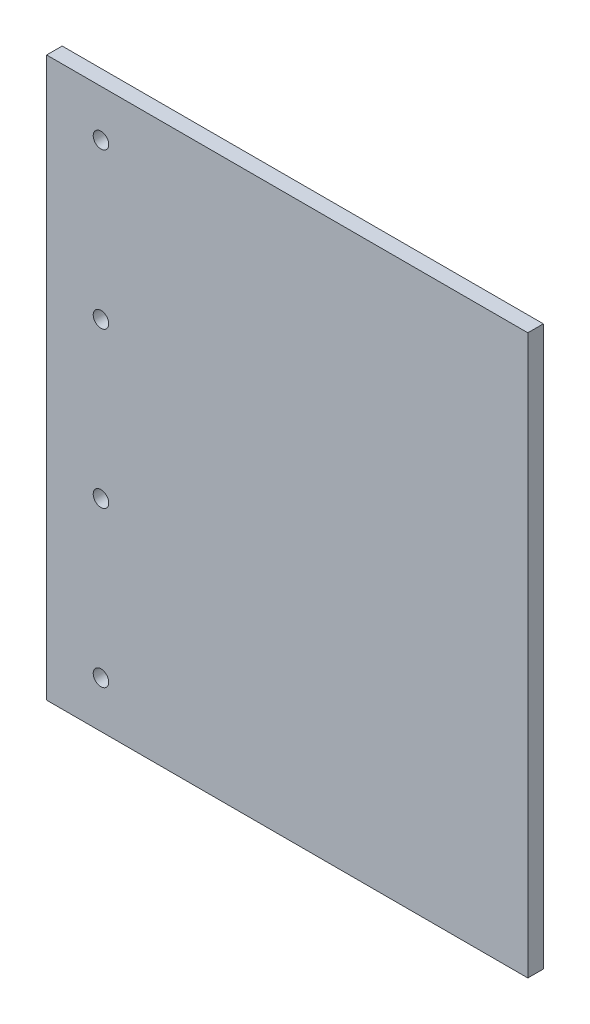
ISO-10303-21;
HEADER;
FILE_DESCRIPTION(('STEP AP214'),'2;1');
FILE_NAME('part.step','',(''),(''),'','','');
FILE_SCHEMA(('AUTOMOTIVE_DESIGN { 1 0 10303 214 1 1 1 1 }'));
ENDSEC;
DATA;
#1=APPLICATION_CONTEXT('core data for automotive mechanical design processes');
#2=APPLICATION_PROTOCOL_DEFINITION('international standard','automotive_design',2000,#1);
#3=PRODUCT_CONTEXT('',#1,'mechanical');
#4=PRODUCT('Part','Part','',(#3));
#5=PRODUCT_RELATED_PRODUCT_CATEGORY('part','',(#4));
#6=PRODUCT_DEFINITION_FORMATION('','',#4);
#7=PRODUCT_DEFINITION_CONTEXT('part definition',#1,'design');
#8=PRODUCT_DEFINITION('design','',#6,#7);
#9=PRODUCT_DEFINITION_SHAPE('','',#8);
#10=(LENGTH_UNIT() NAMED_UNIT(*) SI_UNIT(.MILLI.,.METRE.));
#11=(NAMED_UNIT(*) PLANE_ANGLE_UNIT() SI_UNIT($,.RADIAN.));
#12=(NAMED_UNIT(*) SI_UNIT($,.STERADIAN.) SOLID_ANGLE_UNIT());
#13=UNCERTAINTY_MEASURE_WITH_UNIT(LENGTH_MEASURE(1.E-05),#10,'distance_accuracy_value','');
#14=(GEOMETRIC_REPRESENTATION_CONTEXT(3) GLOBAL_UNCERTAINTY_ASSIGNED_CONTEXT((#13)) GLOBAL_UNIT_ASSIGNED_CONTEXT((#10,
#11,#12)) REPRESENTATION_CONTEXT('',''));
#15=CARTESIAN_POINT('',(0.,0.,0.));
#16=DIRECTION('',(0.,0.,1.));
#17=DIRECTION('',(1.,0.,0.));
#18=AXIS2_PLACEMENT_3D('',#15,#16,#17);
#19=CARTESIAN_POINT('',(0.,0.,12.7));
#20=DIRECTION('',(1.,0.,0.));
#21=DIRECTION('',(0.,0.,-1.));
#22=AXIS2_PLACEMENT_3D('',#19,#20,#21);
#23=PLANE('',#22);
#24=DIRECTION('',(0.,-1.,0.));
#25=VECTOR('',#24,1.);
#26=CARTESIAN_POINT('',(0.,0.,0.));
#27=LINE('',#26,#25);
#28=CARTESIAN_POINT('',(0.,457.2,0.));
#29=VERTEX_POINT('',#28);
#30=CARTESIAN_POINT('',(0.,0.,0.));
#31=VERTEX_POINT('',#30);
#32=EDGE_CURVE('E103',#29,#31,#27,.T.);
#33=ORIENTED_EDGE('',*,*,#32,.T.);
#34=DIRECTION('',(0.,0.,-1.));
#35=VECTOR('',#34,1.);
#36=CARTESIAN_POINT('',(0.,0.,12.7));
#37=LINE('',#36,#35);
#38=CARTESIAN_POINT('',(0.,0.,12.7));
#39=VERTEX_POINT('',#38);
#40=EDGE_CURVE('E94',#39,#31,#37,.T.);
#41=ORIENTED_EDGE('',*,*,#40,.F.);
#42=DIRECTION('',(0.,-1.,0.));
#43=VECTOR('',#42,1.);
#44=CARTESIAN_POINT('',(0.,0.,12.7));
#45=LINE('',#44,#43);
#46=CARTESIAN_POINT('',(0.,457.2,12.7));
#47=VERTEX_POINT('',#46);
#48=EDGE_CURVE('E88',#47,#39,#45,.T.);
#49=ORIENTED_EDGE('',*,*,#48,.F.);
#50=DIRECTION('',(0.,0.,-1.));
#51=VECTOR('',#50,1.);
#52=CARTESIAN_POINT('',(0.,457.2,12.7));
#53=LINE('',#52,#51);
#54=EDGE_CURVE('E99',#47,#29,#53,.T.);
#55=ORIENTED_EDGE('',*,*,#54,.T.);
#56=EDGE_LOOP('',(#33,#41,#49,#55));
#57=FACE_BOUND('',#56,.T.);
#58=ADVANCED_FACE('F34',(#57),#23,.F.);
#59=CARTESIAN_POINT('',(0.,0.,12.7));
#60=DIRECTION('',(0.,1.,0.));
#61=DIRECTION('',(0.,0.,1.));
#62=AXIS2_PLACEMENT_3D('',#59,#60,#61);
#63=PLANE('',#62);
#64=DIRECTION('',(1.,0.,0.));
#65=VECTOR('',#64,1.);
#66=CARTESIAN_POINT('',(0.,0.,0.));
#67=LINE('',#66,#65);
#68=CARTESIAN_POINT('',(393.7,0.,0.));
#69=VERTEX_POINT('',#68);
#70=EDGE_CURVE('E93',#31,#69,#67,.T.);
#71=ORIENTED_EDGE('',*,*,#70,.T.);
#72=DIRECTION('',(0.,0.,-1.));
#73=VECTOR('',#72,1.);
#74=CARTESIAN_POINT('',(393.7,0.,12.7));
#75=LINE('',#74,#73);
#76=CARTESIAN_POINT('',(393.7,0.,12.7));
#77=VERTEX_POINT('',#76);
#78=EDGE_CURVE('E91',#77,#69,#75,.T.);
#79=ORIENTED_EDGE('',*,*,#78,.F.);
#80=DIRECTION('',(1.,0.,0.));
#81=VECTOR('',#80,1.);
#82=CARTESIAN_POINT('',(0.,0.,12.7));
#83=LINE('',#82,#81);
#84=EDGE_CURVE('E82',#39,#77,#83,.T.);
#85=ORIENTED_EDGE('',*,*,#84,.F.);
#86=ORIENTED_EDGE('',*,*,#40,.T.);
#87=EDGE_LOOP('',(#71,#79,#85,#86));
#88=FACE_BOUND('',#87,.T.);
#89=ADVANCED_FACE('F92',(#88),#63,.F.);
#90=CARTESIAN_POINT('',(393.7,0.,12.7));
#91=DIRECTION('',(-1.,0.,0.));
#92=DIRECTION('',(0.,0.,1.));
#93=AXIS2_PLACEMENT_3D('',#90,#91,#92);
#94=PLANE('',#93);
#95=DIRECTION('',(0.,1.,0.));
#96=VECTOR('',#95,1.);
#97=CARTESIAN_POINT('',(393.7,0.,0.));
#98=LINE('',#97,#96);
#99=CARTESIAN_POINT('',(393.7,457.2,0.));
#100=VERTEX_POINT('',#99);
#101=EDGE_CURVE('E68',#69,#100,#98,.T.);
#102=ORIENTED_EDGE('',*,*,#101,.T.);
#103=DIRECTION('',(0.,0.,-1.));
#104=VECTOR('',#103,1.);
#105=CARTESIAN_POINT('',(393.7,457.2,12.7));
#106=LINE('',#105,#104);
#107=CARTESIAN_POINT('',(393.7,457.2,12.7));
#108=VERTEX_POINT('',#107);
#109=EDGE_CURVE('E95',#108,#100,#106,.T.);
#110=ORIENTED_EDGE('',*,*,#109,.F.);
#111=DIRECTION('',(0.,1.,0.));
#112=VECTOR('',#111,1.);
#113=CARTESIAN_POINT('',(393.7,0.,12.7));
#114=LINE('',#113,#112);
#115=EDGE_CURVE('E86',#77,#108,#114,.T.);
#116=ORIENTED_EDGE('',*,*,#115,.F.);
#117=ORIENTED_EDGE('',*,*,#78,.T.);
#118=EDGE_LOOP('',(#102,#110,#116,#117));
#119=FACE_BOUND('',#118,.T.);
#120=ADVANCED_FACE('F97',(#119),#94,.F.);
#121=CARTESIAN_POINT('',(0.,457.2,12.7));
#122=DIRECTION('',(0.,-1.,0.));
#123=DIRECTION('',(0.,0.,-1.));
#124=AXIS2_PLACEMENT_3D('',#121,#122,#123);
#125=PLANE('',#124);
#126=DIRECTION('',(-1.,0.,0.));
#127=VECTOR('',#126,1.);
#128=CARTESIAN_POINT('',(0.,457.2,0.));
#129=LINE('',#128,#127);
#130=EDGE_CURVE('E74',#100,#29,#129,.T.);
#131=ORIENTED_EDGE('',*,*,#130,.T.);
#132=ORIENTED_EDGE('',*,*,#54,.F.);
#133=DIRECTION('',(-1.,0.,0.));
#134=VECTOR('',#133,1.);
#135=CARTESIAN_POINT('',(0.,457.2,12.7));
#136=LINE('',#135,#134);
#137=EDGE_CURVE('E51',#108,#47,#136,.T.);
#138=ORIENTED_EDGE('',*,*,#137,.F.);
#139=ORIENTED_EDGE('',*,*,#109,.T.);
#140=EDGE_LOOP('',(#131,#132,#138,#139));
#141=FACE_BOUND('',#140,.T.);
#142=ADVANCED_FACE('F138',(#141),#125,.F.);
#143=CARTESIAN_POINT('',(0.,457.2,12.7));
#144=DIRECTION('',(0.,0.,-1.));
#145=DIRECTION('',(-1.,0.,0.));
#146=AXIS2_PLACEMENT_3D('',#143,#144,#145);
#147=PLANE('',#146);
#148=CARTESIAN_POINT('',(44.45,165.1,12.7));
#149=DIRECTION('',(0.,0.,1.));
#150=DIRECTION('',(1.,0.,0.));
#151=AXIS2_PLACEMENT_3D('',#148,#149,#150);
#152=CIRCLE('',#151,6.34999999999999);
#153=CARTESIAN_POINT('',(50.8,165.1,12.7));
#154=VERTEX_POINT('',#153);
#155=EDGE_CURVE('E174',#154,#154,#152,.T.);
#156=ORIENTED_EDGE('',*,*,#155,.F.);
#157=EDGE_LOOP('',(#156));
#158=FACE_BOUND('',#157,.T.);
#159=CARTESIAN_POINT('',(44.45,38.1,12.7));
#160=DIRECTION('',(0.,0.,1.));
#161=DIRECTION('',(1.,0.,0.));
#162=AXIS2_PLACEMENT_3D('',#159,#160,#161);
#163=CIRCLE('',#162,6.34999999999999);
#164=CARTESIAN_POINT('',(50.8,38.1,12.7));
#165=VERTEX_POINT('',#164);
#166=EDGE_CURVE('E116',#165,#165,#163,.T.);
#167=ORIENTED_EDGE('',*,*,#166,.F.);
#168=EDGE_LOOP('',(#167));
#169=FACE_BOUND('',#168,.T.);
#170=ORIENTED_EDGE('',*,*,#48,.T.);
#171=ORIENTED_EDGE('',*,*,#84,.T.);
#172=ORIENTED_EDGE('',*,*,#115,.T.);
#173=ORIENTED_EDGE('',*,*,#137,.T.);
#174=EDGE_LOOP('',(#170,#171,#172,#173));
#175=FACE_BOUND('',#174,.T.);
#176=CARTESIAN_POINT('',(44.45,292.1,12.7));
#177=DIRECTION('',(0.,0.,1.));
#178=DIRECTION('',(1.,0.,0.));
#179=AXIS2_PLACEMENT_3D('',#176,#177,#178);
#180=CIRCLE('',#179,6.34999999999999);
#181=CARTESIAN_POINT('',(50.8,292.1,12.7));
#182=VERTEX_POINT('',#181);
#183=EDGE_CURVE('E119',#182,#182,#180,.T.);
#184=ORIENTED_EDGE('',*,*,#183,.F.);
#185=EDGE_LOOP('',(#184));
#186=FACE_BOUND('',#185,.T.);
#187=CARTESIAN_POINT('',(44.45,419.1,12.7));
#188=DIRECTION('',(0.,0.,1.));
#189=DIRECTION('',(1.,0.,0.));
#190=AXIS2_PLACEMENT_3D('',#187,#188,#189);
#191=CIRCLE('',#190,6.34999999999999);
#192=CARTESIAN_POINT('',(50.8,419.1,12.7));
#193=VERTEX_POINT('',#192);
#194=EDGE_CURVE('E11',#193,#193,#191,.T.);
#195=ORIENTED_EDGE('',*,*,#194,.F.);
#196=EDGE_LOOP('',(#195));
#197=FACE_BOUND('',#196,.T.);
#198=ADVANCED_FACE('F83',(#158,#169,#175,#186,#197),#147,.F.);
#199=CARTESIAN_POINT('',(0.,457.2,0.));
#200=DIRECTION('',(0.,0.,-1.));
#201=DIRECTION('',(-1.,0.,0.));
#202=AXIS2_PLACEMENT_3D('',#199,#200,#201);
#203=PLANE('',#202);
#204=CARTESIAN_POINT('',(44.45,165.1,0.));
#205=DIRECTION('',(0.,0.,-1.));
#206=DIRECTION('',(-1.,0.,0.));
#207=AXIS2_PLACEMENT_3D('',#204,#205,#206);
#208=CIRCLE('',#207,6.34999999999999);
#209=CARTESIAN_POINT('',(38.1,165.1,0.));
#210=VERTEX_POINT('',#209);
#211=EDGE_CURVE('E171',#210,#210,#208,.T.);
#212=ORIENTED_EDGE('',*,*,#211,.F.);
#213=EDGE_LOOP('',(#212));
#214=FACE_BOUND('',#213,.T.);
#215=CARTESIAN_POINT('',(44.45,38.1,0.));
#216=DIRECTION('',(0.,0.,-1.));
#217=DIRECTION('',(-1.,0.,0.));
#218=AXIS2_PLACEMENT_3D('',#215,#216,#217);
#219=CIRCLE('',#218,6.34999999999999);
#220=CARTESIAN_POINT('',(38.1,38.1,0.));
#221=VERTEX_POINT('',#220);
#222=EDGE_CURVE('E106',#221,#221,#219,.T.);
#223=ORIENTED_EDGE('',*,*,#222,.F.);
#224=EDGE_LOOP('',(#223));
#225=FACE_BOUND('',#224,.T.);
#226=ORIENTED_EDGE('',*,*,#32,.F.);
#227=ORIENTED_EDGE('',*,*,#130,.F.);
#228=ORIENTED_EDGE('',*,*,#101,.F.);
#229=ORIENTED_EDGE('',*,*,#70,.F.);
#230=EDGE_LOOP('',(#226,#227,#228,#229));
#231=FACE_BOUND('',#230,.T.);
#232=CARTESIAN_POINT('',(44.45,292.1,0.));
#233=DIRECTION('',(0.,0.,-1.));
#234=DIRECTION('',(-1.,0.,0.));
#235=AXIS2_PLACEMENT_3D('',#232,#233,#234);
#236=CIRCLE('',#235,6.34999999999999);
#237=CARTESIAN_POINT('',(38.1,292.1,0.));
#238=VERTEX_POINT('',#237);
#239=EDGE_CURVE('E113',#238,#238,#236,.T.);
#240=ORIENTED_EDGE('',*,*,#239,.F.);
#241=EDGE_LOOP('',(#240));
#242=FACE_BOUND('',#241,.T.);
#243=CARTESIAN_POINT('',(44.45,419.1,0.));
#244=DIRECTION('',(0.,0.,-1.));
#245=DIRECTION('',(-1.,0.,0.));
#246=AXIS2_PLACEMENT_3D('',#243,#244,#245);
#247=CIRCLE('',#246,6.34999999999999);
#248=CARTESIAN_POINT('',(38.1,419.1,0.));
#249=VERTEX_POINT('',#248);
#250=EDGE_CURVE('E43',#249,#249,#247,.T.);
#251=ORIENTED_EDGE('',*,*,#250,.F.);
#252=EDGE_LOOP('',(#251));
#253=FACE_BOUND('',#252,.T.);
#254=ADVANCED_FACE('F126',(#214,#225,#231,#242,#253),#203,.T.);
#255=CARTESIAN_POINT('',(44.45,38.1,12.7));
#256=DIRECTION('',(0.,0.,1.));
#257=DIRECTION('',(1.,0.,0.));
#258=AXIS2_PLACEMENT_3D('',#255,#256,#257);
#259=CYLINDRICAL_SURFACE('',#258,6.34999999999999);
#260=ORIENTED_EDGE('',*,*,#222,.T.);
#261=EDGE_LOOP('',(#260));
#262=FACE_BOUND('',#261,.T.);
#263=ORIENTED_EDGE('',*,*,#166,.T.);
#264=EDGE_LOOP('',(#263));
#265=FACE_BOUND('',#264,.T.);
#266=ADVANCED_FACE('F128',(#262,#265),#259,.F.);
#267=CARTESIAN_POINT('',(44.45,165.1,12.7));
#268=DIRECTION('',(0.,0.,1.));
#269=DIRECTION('',(1.,0.,0.));
#270=AXIS2_PLACEMENT_3D('',#267,#268,#269);
#271=CYLINDRICAL_SURFACE('',#270,6.34999999999999);
#272=ORIENTED_EDGE('',*,*,#211,.T.);
#273=EDGE_LOOP('',(#272));
#274=FACE_BOUND('',#273,.T.);
#275=ORIENTED_EDGE('',*,*,#155,.T.);
#276=EDGE_LOOP('',(#275));
#277=FACE_BOUND('',#276,.T.);
#278=ADVANCED_FACE('F135',(#274,#277),#271,.F.);
#279=CARTESIAN_POINT('',(44.45,292.1,12.7));
#280=DIRECTION('',(0.,0.,1.));
#281=DIRECTION('',(1.,0.,0.));
#282=AXIS2_PLACEMENT_3D('',#279,#280,#281);
#283=CYLINDRICAL_SURFACE('',#282,6.34999999999999);
#284=ORIENTED_EDGE('',*,*,#239,.T.);
#285=EDGE_LOOP('',(#284));
#286=FACE_BOUND('',#285,.T.);
#287=ORIENTED_EDGE('',*,*,#183,.T.);
#288=EDGE_LOOP('',(#287));
#289=FACE_BOUND('',#288,.T.);
#290=ADVANCED_FACE('F152',(#286,#289),#283,.F.);
#291=CARTESIAN_POINT('',(44.45,419.1,12.7));
#292=DIRECTION('',(0.,0.,1.));
#293=DIRECTION('',(1.,0.,0.));
#294=AXIS2_PLACEMENT_3D('',#291,#292,#293);
#295=CYLINDRICAL_SURFACE('',#294,6.34999999999999);
#296=ORIENTED_EDGE('',*,*,#250,.T.);
#297=EDGE_LOOP('',(#296));
#298=FACE_BOUND('',#297,.T.);
#299=ORIENTED_EDGE('',*,*,#194,.T.);
#300=EDGE_LOOP('',(#299));
#301=FACE_BOUND('',#300,.T.);
#302=ADVANCED_FACE('F36',(#298,#301),#295,.F.);
#303=CLOSED_SHELL('',(#58,#89,#120,#142,#198,#254,#266,#278,#290,#302));
#304=MANIFOLD_SOLID_BREP('B2',#303);
#305=ADVANCED_BREP_SHAPE_REPRESENTATION('',(#18,#304),#14);
#306=SHAPE_DEFINITION_REPRESENTATION(#9,#305);
ENDSEC;
END-ISO-10303-21;
